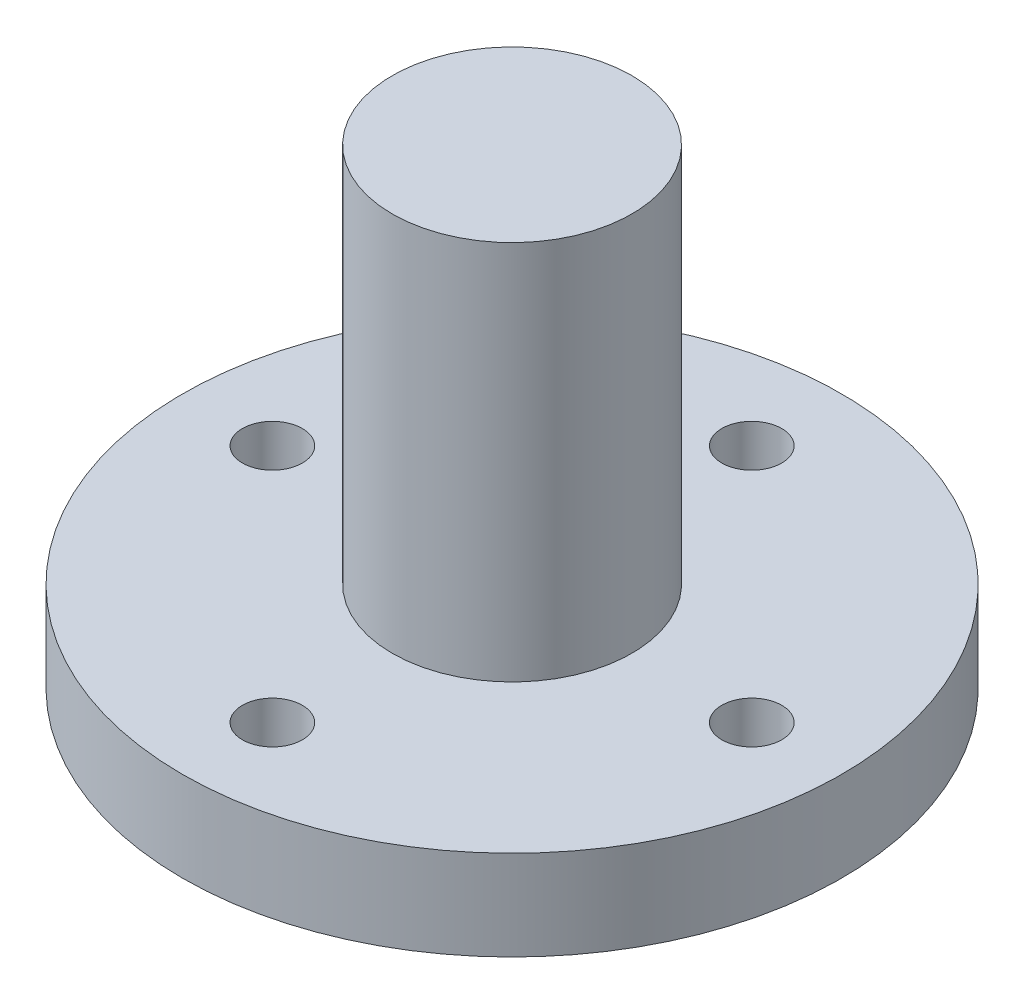
ISO-10303-21;
HEADER;
FILE_DESCRIPTION(('STEP AP214'),'2;1');
FILE_NAME('part.step','',(''),(''),'','','');
FILE_SCHEMA(('AUTOMOTIVE_DESIGN { 1 0 10303 214 1 1 1 1 }'));
ENDSEC;
DATA;
#1=APPLICATION_CONTEXT('core data for automotive mechanical design processes');
#2=APPLICATION_PROTOCOL_DEFINITION('international standard','automotive_design',2000,#1);
#3=PRODUCT_CONTEXT('',#1,'mechanical');
#4=PRODUCT('Part','Part','',(#3));
#5=PRODUCT_RELATED_PRODUCT_CATEGORY('part','',(#4));
#6=PRODUCT_DEFINITION_FORMATION('','',#4);
#7=PRODUCT_DEFINITION_CONTEXT('part definition',#1,'design');
#8=PRODUCT_DEFINITION('design','',#6,#7);
#9=PRODUCT_DEFINITION_SHAPE('','',#8);
#10=(LENGTH_UNIT() NAMED_UNIT(*) SI_UNIT(.MILLI.,.METRE.));
#11=(NAMED_UNIT(*) PLANE_ANGLE_UNIT() SI_UNIT($,.RADIAN.));
#12=(NAMED_UNIT(*) SI_UNIT($,.STERADIAN.) SOLID_ANGLE_UNIT());
#13=UNCERTAINTY_MEASURE_WITH_UNIT(LENGTH_MEASURE(1.E-05),#10,'distance_accuracy_value','');
#14=(GEOMETRIC_REPRESENTATION_CONTEXT(3) GLOBAL_UNCERTAINTY_ASSIGNED_CONTEXT((#13)) GLOBAL_UNIT_ASSIGNED_CONTEXT((#10,
#11,#12)) REPRESENTATION_CONTEXT('',''));
#15=CARTESIAN_POINT('',(0.,0.,0.));
#16=DIRECTION('',(0.,0.,1.));
#17=DIRECTION('',(1.,0.,0.));
#18=AXIS2_PLACEMENT_3D('',#15,#16,#17);
#19=CARTESIAN_POINT('',(0.,3.,0.));
#20=DIRECTION('',(0.,1.,0.));
#21=DIRECTION('',(0.,0.,1.));
#22=AXIS2_PLACEMENT_3D('',#19,#20,#21);
#23=PLANE('',#22);
#24=CARTESIAN_POINT('',(0.,3.,0.));
#25=DIRECTION('',(0.,1.,0.));
#26=DIRECTION('',(0.,0.,1.));
#27=AXIS2_PLACEMENT_3D('',#24,#25,#26);
#28=CIRCLE('',#27,4.);
#29=CARTESIAN_POINT('',(0.,3.,4.));
#30=VERTEX_POINT('',#29);
#31=EDGE_CURVE('E88',#30,#30,#28,.T.);
#32=ORIENTED_EDGE('',*,*,#31,.F.);
#33=EDGE_LOOP('',(#32));
#34=FACE_BOUND('',#33,.T.);
#35=CARTESIAN_POINT('',(0.,3.,8.));
#36=DIRECTION('',(0.,1.,0.));
#37=DIRECTION('',(0.,0.,1.));
#38=AXIS2_PLACEMENT_3D('',#35,#36,#37);
#39=CIRCLE('',#38,1.00000000000005);
#40=CARTESIAN_POINT('',(0.,3.,9.00000000000006));
#41=VERTEX_POINT('',#40);
#42=EDGE_CURVE('E68',#41,#41,#39,.T.);
#43=ORIENTED_EDGE('',*,*,#42,.F.);
#44=EDGE_LOOP('',(#43));
#45=FACE_BOUND('',#44,.T.);
#46=CARTESIAN_POINT('',(0.,3.,-8.));
#47=DIRECTION('',(0.,1.,0.));
#48=DIRECTION('',(0.,0.,1.));
#49=AXIS2_PLACEMENT_3D('',#46,#47,#48);
#50=CIRCLE('',#49,1.);
#51=CARTESIAN_POINT('',(0.,3.,-7.));
#52=VERTEX_POINT('',#51);
#53=EDGE_CURVE('E54',#52,#52,#50,.T.);
#54=ORIENTED_EDGE('',*,*,#53,.F.);
#55=EDGE_LOOP('',(#54));
#56=FACE_BOUND('',#55,.T.);
#57=CARTESIAN_POINT('',(0.,3.,0.));
#58=DIRECTION('',(0.,1.,0.));
#59=DIRECTION('',(0.,0.,1.));
#60=AXIS2_PLACEMENT_3D('',#57,#58,#59);
#61=CIRCLE('',#60,11.);
#62=CARTESIAN_POINT('',(0.,3.,11.));
#63=VERTEX_POINT('',#62);
#64=EDGE_CURVE('E10',#63,#63,#61,.T.);
#65=ORIENTED_EDGE('',*,*,#64,.T.);
#66=EDGE_LOOP('',(#65));
#67=FACE_BOUND('',#66,.T.);
#68=CARTESIAN_POINT('',(8.,3.,0.));
#69=DIRECTION('',(0.,1.,0.));
#70=DIRECTION('',(0.,0.,1.));
#71=AXIS2_PLACEMENT_3D('',#68,#69,#70);
#72=CIRCLE('',#71,1.00000000000003);
#73=CARTESIAN_POINT('',(8.,3.,1.00000000000003));
#74=VERTEX_POINT('',#73);
#75=EDGE_CURVE('E60',#74,#74,#72,.T.);
#76=ORIENTED_EDGE('',*,*,#75,.F.);
#77=EDGE_LOOP('',(#76));
#78=FACE_BOUND('',#77,.T.);
#79=CARTESIAN_POINT('',(-8.,3.,0.));
#80=DIRECTION('',(0.,1.,0.));
#81=DIRECTION('',(0.,0.,1.));
#82=AXIS2_PLACEMENT_3D('',#79,#80,#81);
#83=CIRCLE('',#82,1.00000000000008);
#84=CARTESIAN_POINT('',(-8.,3.,1.00000000000008));
#85=VERTEX_POINT('',#84);
#86=EDGE_CURVE('E76',#85,#85,#83,.T.);
#87=ORIENTED_EDGE('',*,*,#86,.F.);
#88=EDGE_LOOP('',(#87));
#89=FACE_BOUND('',#88,.T.);
#90=ADVANCED_FACE('F41',(#34,#45,#56,#67,#78,#89),#23,.T.);
#91=CARTESIAN_POINT('',(0.,0.,0.));
#92=DIRECTION('',(0.,1.,0.));
#93=DIRECTION('',(0.,0.,1.));
#94=AXIS2_PLACEMENT_3D('',#91,#92,#93);
#95=PLANE('',#94);
#96=CARTESIAN_POINT('',(0.,0.,0.));
#97=DIRECTION('',(0.,1.,0.));
#98=DIRECTION('',(0.,0.,1.));
#99=AXIS2_PLACEMENT_3D('',#96,#97,#98);
#100=CIRCLE('',#99,11.);
#101=CARTESIAN_POINT('',(0.,0.,11.));
#102=VERTEX_POINT('',#101);
#103=EDGE_CURVE('E45',#102,#102,#100,.T.);
#104=ORIENTED_EDGE('',*,*,#103,.F.);
#105=EDGE_LOOP('',(#104));
#106=FACE_BOUND('',#105,.T.);
#107=CARTESIAN_POINT('',(0.,0.,-8.));
#108=DIRECTION('',(0.,1.,0.));
#109=DIRECTION('',(0.,0.,1.));
#110=AXIS2_PLACEMENT_3D('',#107,#108,#109);
#111=CIRCLE('',#110,1.);
#112=CARTESIAN_POINT('',(0.,0.,-7.));
#113=VERTEX_POINT('',#112);
#114=EDGE_CURVE('E56',#113,#113,#111,.T.);
#115=ORIENTED_EDGE('',*,*,#114,.T.);
#116=EDGE_LOOP('',(#115));
#117=FACE_BOUND('',#116,.T.);
#118=CARTESIAN_POINT('',(8.,0.,0.));
#119=DIRECTION('',(0.,1.,0.));
#120=DIRECTION('',(0.,0.,1.));
#121=AXIS2_PLACEMENT_3D('',#118,#119,#120);
#122=CIRCLE('',#121,1.00000000000003);
#123=CARTESIAN_POINT('',(8.,0.,1.00000000000003));
#124=VERTEX_POINT('',#123);
#125=EDGE_CURVE('E64',#124,#124,#122,.T.);
#126=ORIENTED_EDGE('',*,*,#125,.T.);
#127=EDGE_LOOP('',(#126));
#128=FACE_BOUND('',#127,.T.);
#129=CARTESIAN_POINT('',(0.,0.,8.));
#130=DIRECTION('',(0.,1.,0.));
#131=DIRECTION('',(0.,0.,1.));
#132=AXIS2_PLACEMENT_3D('',#129,#130,#131);
#133=CIRCLE('',#132,1.00000000000005);
#134=CARTESIAN_POINT('',(0.,0.,9.00000000000006));
#135=VERTEX_POINT('',#134);
#136=EDGE_CURVE('E72',#135,#135,#133,.T.);
#137=ORIENTED_EDGE('',*,*,#136,.T.);
#138=EDGE_LOOP('',(#137));
#139=FACE_BOUND('',#138,.T.);
#140=CARTESIAN_POINT('',(-8.,0.,0.));
#141=DIRECTION('',(0.,1.,0.));
#142=DIRECTION('',(0.,0.,1.));
#143=AXIS2_PLACEMENT_3D('',#140,#141,#142);
#144=CIRCLE('',#143,1.00000000000008);
#145=CARTESIAN_POINT('',(-8.,0.,1.00000000000008));
#146=VERTEX_POINT('',#145);
#147=EDGE_CURVE('E80',#146,#146,#144,.T.);
#148=ORIENTED_EDGE('',*,*,#147,.T.);
#149=EDGE_LOOP('',(#148));
#150=FACE_BOUND('',#149,.T.);
#151=ADVANCED_FACE('F107',(#106,#117,#128,#139,#150),#95,.F.);
#152=CARTESIAN_POINT('',(0.,3.,0.));
#153=DIRECTION('',(0.,-1.,0.));
#154=DIRECTION('',(0.,0.,-1.));
#155=AXIS2_PLACEMENT_3D('',#152,#153,#154);
#156=CYLINDRICAL_SURFACE('',#155,11.);
#157=ORIENTED_EDGE('',*,*,#64,.F.);
#158=EDGE_LOOP('',(#157));
#159=FACE_BOUND('',#158,.T.);
#160=ORIENTED_EDGE('',*,*,#103,.T.);
#161=EDGE_LOOP('',(#160));
#162=FACE_BOUND('',#161,.T.);
#163=ADVANCED_FACE('F43',(#159,#162),#156,.T.);
#164=CARTESIAN_POINT('',(0.,3.,-8.));
#165=DIRECTION('',(0.,-1.,0.));
#166=DIRECTION('',(0.,0.,-1.));
#167=AXIS2_PLACEMENT_3D('',#164,#165,#166);
#168=CYLINDRICAL_SURFACE('',#167,1.);
#169=ORIENTED_EDGE('',*,*,#53,.T.);
#170=EDGE_LOOP('',(#169));
#171=FACE_BOUND('',#170,.T.);
#172=ORIENTED_EDGE('',*,*,#114,.F.);
#173=EDGE_LOOP('',(#172));
#174=FACE_BOUND('',#173,.T.);
#175=ADVANCED_FACE('F129',(#171,#174),#168,.F.);
#176=CARTESIAN_POINT('',(8.,3.,0.));
#177=DIRECTION('',(0.,-1.,0.));
#178=DIRECTION('',(0.,0.,-1.));
#179=AXIS2_PLACEMENT_3D('',#176,#177,#178);
#180=CYLINDRICAL_SURFACE('',#179,1.00000000000003);
#181=ORIENTED_EDGE('',*,*,#75,.T.);
#182=EDGE_LOOP('',(#181));
#183=FACE_BOUND('',#182,.T.);
#184=ORIENTED_EDGE('',*,*,#125,.F.);
#185=EDGE_LOOP('',(#184));
#186=FACE_BOUND('',#185,.T.);
#187=ADVANCED_FACE('F136',(#183,#186),#180,.F.);
#188=CARTESIAN_POINT('',(0.,3.,8.));
#189=DIRECTION('',(0.,-1.,0.));
#190=DIRECTION('',(0.,0.,-1.));
#191=AXIS2_PLACEMENT_3D('',#188,#189,#190);
#192=CYLINDRICAL_SURFACE('',#191,1.00000000000005);
#193=ORIENTED_EDGE('',*,*,#42,.T.);
#194=EDGE_LOOP('',(#193));
#195=FACE_BOUND('',#194,.T.);
#196=ORIENTED_EDGE('',*,*,#136,.F.);
#197=EDGE_LOOP('',(#196));
#198=FACE_BOUND('',#197,.T.);
#199=ADVANCED_FACE('F119',(#195,#198),#192,.F.);
#200=CARTESIAN_POINT('',(-8.,3.,0.));
#201=DIRECTION('',(0.,-1.,0.));
#202=DIRECTION('',(0.,0.,-1.));
#203=AXIS2_PLACEMENT_3D('',#200,#201,#202);
#204=CYLINDRICAL_SURFACE('',#203,1.00000000000008);
#205=ORIENTED_EDGE('',*,*,#86,.T.);
#206=EDGE_LOOP('',(#205));
#207=FACE_BOUND('',#206,.T.);
#208=ORIENTED_EDGE('',*,*,#147,.F.);
#209=EDGE_LOOP('',(#208));
#210=FACE_BOUND('',#209,.T.);
#211=ADVANCED_FACE('F101',(#207,#210),#204,.F.);
#212=CARTESIAN_POINT('',(0.,15.7,0.));
#213=DIRECTION('',(0.,-1.,0.));
#214=DIRECTION('',(0.,0.,-1.));
#215=AXIS2_PLACEMENT_3D('',#212,#213,#214);
#216=CYLINDRICAL_SURFACE('',#215,4.);
#217=CARTESIAN_POINT('',(0.,15.7,0.));
#218=DIRECTION('',(0.,1.,0.));
#219=DIRECTION('',(0.,0.,1.));
#220=AXIS2_PLACEMENT_3D('',#217,#218,#219);
#221=CIRCLE('',#220,4.);
#222=CARTESIAN_POINT('',(0.,15.7,4.));
#223=VERTEX_POINT('',#222);
#224=EDGE_CURVE('E84',#223,#223,#221,.T.);
#225=ORIENTED_EDGE('',*,*,#224,.F.);
#226=EDGE_LOOP('',(#225));
#227=FACE_BOUND('',#226,.T.);
#228=ORIENTED_EDGE('',*,*,#31,.T.);
#229=EDGE_LOOP('',(#228));
#230=FACE_BOUND('',#229,.T.);
#231=ADVANCED_FACE('F98',(#227,#230),#216,.T.);
#232=CARTESIAN_POINT('',(0.,15.7,0.));
#233=DIRECTION('',(0.,1.,0.));
#234=DIRECTION('',(0.,0.,1.));
#235=AXIS2_PLACEMENT_3D('',#232,#233,#234);
#236=PLANE('',#235);
#237=ORIENTED_EDGE('',*,*,#224,.T.);
#238=EDGE_LOOP('',(#237));
#239=FACE_BOUND('',#238,.T.);
#240=ADVANCED_FACE('F96',(#239),#236,.T.);
#241=CLOSED_SHELL('',(#90,#151,#163,#175,#187,#199,#211,#231,#240));
#242=MANIFOLD_SOLID_BREP('B2',#241);
#243=ADVANCED_BREP_SHAPE_REPRESENTATION('',(#18,#242),#14);
#244=SHAPE_DEFINITION_REPRESENTATION(#9,#243);
ENDSEC;
END-ISO-10303-21;
